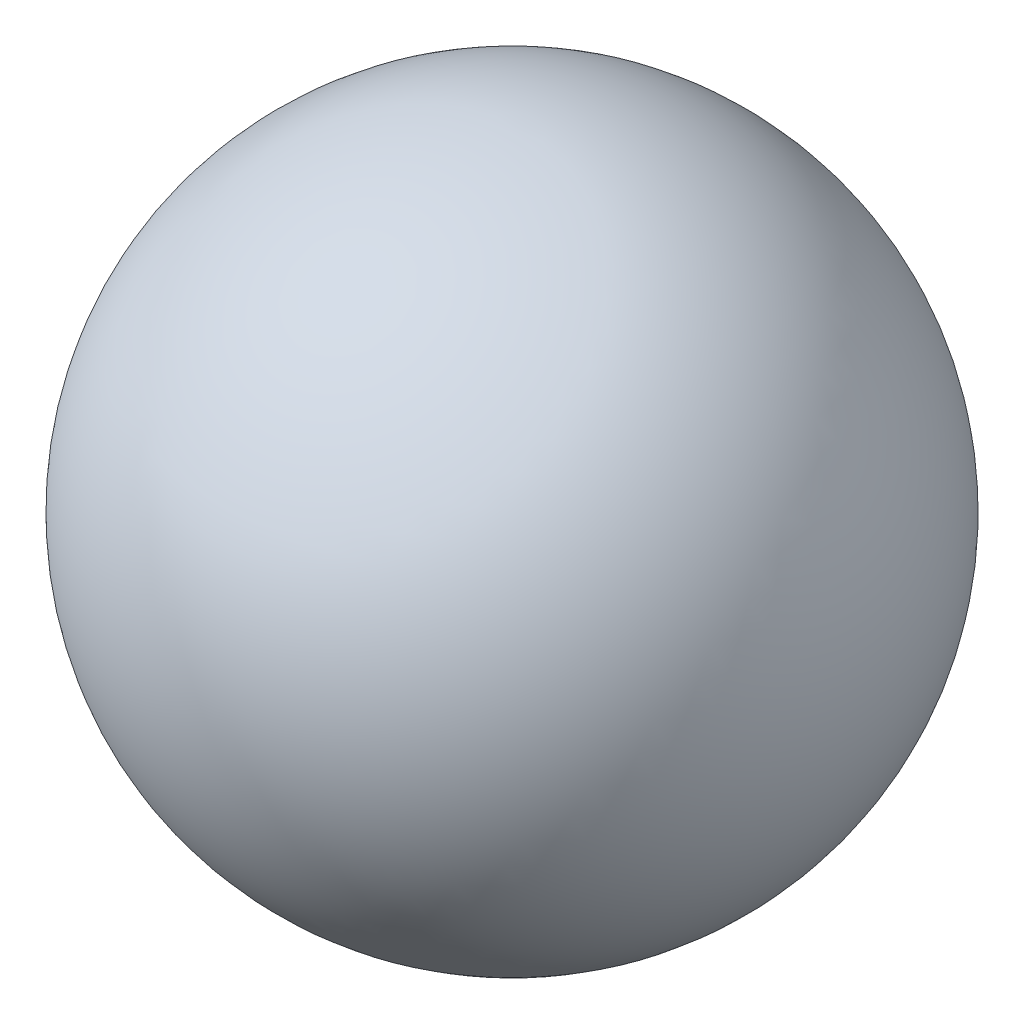
ISO-10303-21;
HEADER;
FILE_DESCRIPTION(('STEP AP214'),'2;1');
FILE_NAME('part.step','',(''),(''),'','','');
FILE_SCHEMA(('AUTOMOTIVE_DESIGN { 1 0 10303 214 1 1 1 1 }'));
ENDSEC;
DATA;
#1=APPLICATION_CONTEXT('core data for automotive mechanical design processes');
#2=APPLICATION_PROTOCOL_DEFINITION('international standard','automotive_design',2000,#1);
#3=PRODUCT_CONTEXT('',#1,'mechanical');
#4=PRODUCT('Part','Part','',(#3));
#5=PRODUCT_RELATED_PRODUCT_CATEGORY('part','',(#4));
#6=PRODUCT_DEFINITION_FORMATION('','',#4);
#7=PRODUCT_DEFINITION_CONTEXT('part definition',#1,'design');
#8=PRODUCT_DEFINITION('design','',#6,#7);
#9=PRODUCT_DEFINITION_SHAPE('','',#8);
#10=(LENGTH_UNIT() NAMED_UNIT(*) SI_UNIT(.MILLI.,.METRE.));
#11=(NAMED_UNIT(*) PLANE_ANGLE_UNIT() SI_UNIT($,.RADIAN.));
#12=(NAMED_UNIT(*) SI_UNIT($,.STERADIAN.) SOLID_ANGLE_UNIT());
#13=UNCERTAINTY_MEASURE_WITH_UNIT(LENGTH_MEASURE(1.E-05),#10,'distance_accuracy_value','');
#14=(GEOMETRIC_REPRESENTATION_CONTEXT(3) GLOBAL_UNCERTAINTY_ASSIGNED_CONTEXT((#13)) GLOBAL_UNIT_ASSIGNED_CONTEXT((#10,
#11,#12)) REPRESENTATION_CONTEXT('',''));
#15=CARTESIAN_POINT('',(0.,0.,0.));
#16=DIRECTION('',(0.,0.,1.));
#17=DIRECTION('',(1.,0.,0.));
#18=AXIS2_PLACEMENT_3D('',#15,#16,#17);
#19=CARTESIAN_POINT('',(0.,0.,0.));
#20=DIRECTION('',(0.,1.,0.));
#21=DIRECTION('',(1.,0.,0.));
#22=AXIS2_PLACEMENT_3D('',#19,#20,#21);
#23=SPHERICAL_SURFACE('',#22,20.);
#24=CARTESIAN_POINT('',(0.,-18.,0.));
#25=DIRECTION('',(0.,1.,0.));
#26=DIRECTION('',(0.,0.,1.));
#27=AXIS2_PLACEMENT_3D('',#24,#25,#26);
#28=CIRCLE('',#27,8.71779788708135);
#29=CARTESIAN_POINT('',(0.,-18.,8.71779788708135));
#30=VERTEX_POINT('',#29);
#31=EDGE_CURVE('E11',#30,#30,#28,.T.);
#32=ORIENTED_EDGE('',*,*,#31,.T.);
#33=EDGE_LOOP('',(#32));
#34=FACE_BOUND('',#33,.T.);
#35=ADVANCED_FACE('F42',(#34),#23,.T.);
#36=CARTESIAN_POINT('',(-8.71779788708135,-18.,86.6025403784439));
#37=DIRECTION('',(0.,1.,0.));
#38=DIRECTION('',(0.,0.,1.));
#39=AXIS2_PLACEMENT_3D('',#36,#37,#38);
#40=PLANE('',#39);
#41=CARTESIAN_POINT('',(0.,-18.,0.));
#42=DIRECTION('',(0.,-1.,0.));
#43=DIRECTION('',(0.,0.,-1.));
#44=AXIS2_PLACEMENT_3D('',#41,#42,#43);
#45=CIRCLE('',#44,4.25);
#46=CARTESIAN_POINT('',(0.,-18.,-4.25));
#47=VERTEX_POINT('',#46);
#48=EDGE_CURVE('E60',#47,#47,#45,.T.);
#49=ORIENTED_EDGE('',*,*,#48,.F.);
#50=EDGE_LOOP('',(#49));
#51=FACE_BOUND('',#50,.T.);
#52=ORIENTED_EDGE('',*,*,#31,.F.);
#53=EDGE_LOOP('',(#52));
#54=FACE_BOUND('',#53,.T.);
#55=ADVANCED_FACE('F55',(#51,#54),#40,.F.);
#56=CARTESIAN_POINT('',(0.,-8.,0.));
#57=DIRECTION('',(0.,-1.,0.));
#58=DIRECTION('',(0.,0.,-1.));
#59=AXIS2_PLACEMENT_3D('',#56,#57,#58);
#60=CONICAL_SURFACE('',#59,4.25,1.02974425867665);
#61=CARTESIAN_POINT('',(0.,-5.44634236913287,0.));
#62=VERTEX_POINT('',#61);
#63=VERTEX_LOOP('',#62);
#64=FACE_BOUND('',#63,.T.);
#65=CARTESIAN_POINT('',(0.,-8.,0.));
#66=DIRECTION('',(0.,-1.,0.));
#67=DIRECTION('',(0.,0.,-1.));
#68=AXIS2_PLACEMENT_3D('',#65,#66,#67);
#69=CIRCLE('',#68,4.25);
#70=CARTESIAN_POINT('',(0.,-8.,-4.25));
#71=VERTEX_POINT('',#70);
#72=EDGE_CURVE('E48',#71,#71,#69,.T.);
#73=ORIENTED_EDGE('',*,*,#72,.T.);
#74=EDGE_LOOP('',(#73));
#75=FACE_BOUND('',#74,.T.);
#76=ADVANCED_FACE('F51',(#64,#75),#60,.F.);
#77=CARTESIAN_POINT('',(0.,-18.,0.));
#78=DIRECTION('',(0.,-1.,0.));
#79=DIRECTION('',(0.,0.,-1.));
#80=AXIS2_PLACEMENT_3D('',#77,#78,#79);
#81=CYLINDRICAL_SURFACE('',#80,4.25);
#82=ORIENTED_EDGE('',*,*,#72,.F.);
#83=EDGE_LOOP('',(#82));
#84=FACE_BOUND('',#83,.T.);
#85=ORIENTED_EDGE('',*,*,#48,.T.);
#86=EDGE_LOOP('',(#85));
#87=FACE_BOUND('',#86,.T.);
#88=ADVANCED_FACE('F54',(#84,#87),#81,.F.);
#89=CLOSED_SHELL('',(#35,#55,#76,#88));
#90=MANIFOLD_SOLID_BREP('B2',#89);
#91=ADVANCED_BREP_SHAPE_REPRESENTATION('',(#18,#90),#14);
#92=SHAPE_DEFINITION_REPRESENTATION(#9,#91);
ENDSEC;
END-ISO-10303-21;
